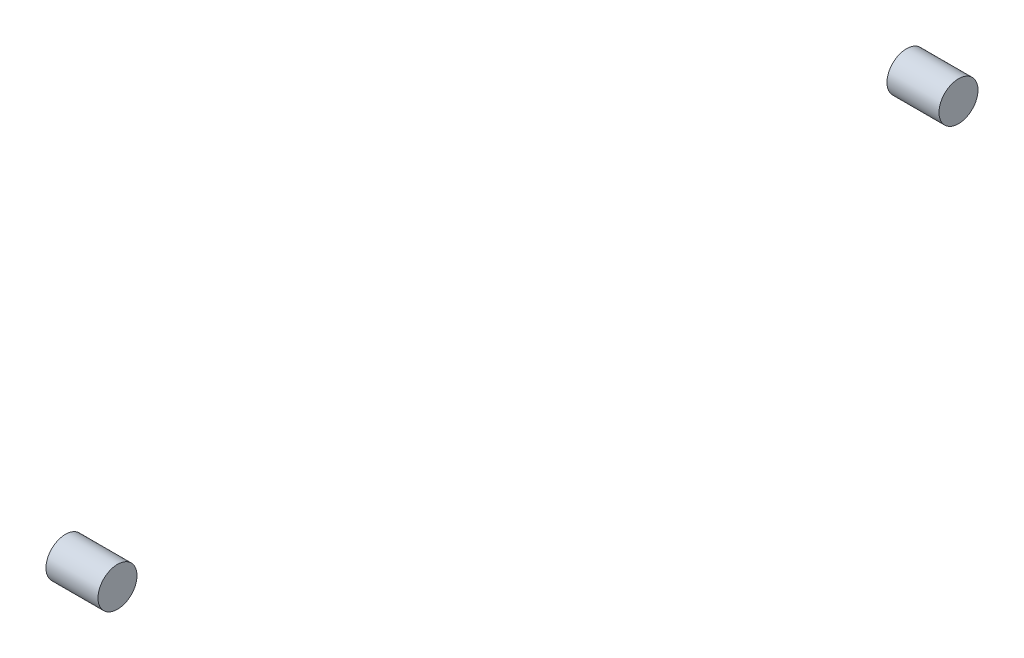
ISO-10303-21;
HEADER;
FILE_DESCRIPTION(('STEP AP214'),'2;1');
FILE_NAME('part.step','',(''),(''),'','','');
FILE_SCHEMA(('AUTOMOTIVE_DESIGN { 1 0 10303 214 1 1 1 1 }'));
ENDSEC;
DATA;
#1=APPLICATION_CONTEXT('core data for automotive mechanical design processes');
#2=APPLICATION_PROTOCOL_DEFINITION('international standard','automotive_design',2000,#1);
#3=PRODUCT_CONTEXT('',#1,'mechanical');
#4=PRODUCT('Part','Part','',(#3));
#5=PRODUCT_RELATED_PRODUCT_CATEGORY('part','',(#4));
#6=PRODUCT_DEFINITION_FORMATION('','',#4);
#7=PRODUCT_DEFINITION_CONTEXT('part definition',#1,'design');
#8=PRODUCT_DEFINITION('design','',#6,#7);
#9=PRODUCT_DEFINITION_SHAPE('','',#8);
#10=(LENGTH_UNIT() NAMED_UNIT(*) SI_UNIT(.MILLI.,.METRE.));
#11=(NAMED_UNIT(*) PLANE_ANGLE_UNIT() SI_UNIT($,.RADIAN.));
#12=(NAMED_UNIT(*) SI_UNIT($,.STERADIAN.) SOLID_ANGLE_UNIT());
#13=UNCERTAINTY_MEASURE_WITH_UNIT(LENGTH_MEASURE(1.E-05),#10,'distance_accuracy_value','');
#14=(GEOMETRIC_REPRESENTATION_CONTEXT(3) GLOBAL_UNCERTAINTY_ASSIGNED_CONTEXT((#13)) GLOBAL_UNIT_ASSIGNED_CONTEXT((#10,
#11,#12)) REPRESENTATION_CONTEXT('',''));
#15=CARTESIAN_POINT('',(0.,0.,0.));
#16=DIRECTION('',(0.,0.,1.));
#17=DIRECTION('',(1.,0.,0.));
#18=AXIS2_PLACEMENT_3D('',#15,#16,#17);
#19=CARTESIAN_POINT('',(-930.,-80.0000000000001,1940.));
#20=DIRECTION('',(-1.,0.,0.));
#21=DIRECTION('',(0.,0.,1.));
#22=AXIS2_PLACEMENT_3D('',#19,#20,#21);
#23=CYLINDRICAL_SURFACE('',#22,90.0000000000001);
#24=CARTESIAN_POINT('',(-930.,-80.0000000000001,1940.));
#25=DIRECTION('',(1.,0.,0.));
#26=DIRECTION('',(0.,0.,-1.));
#27=AXIS2_PLACEMENT_3D('',#24,#25,#26);
#28=CIRCLE('',#27,90.0000000000001);
#29=CARTESIAN_POINT('',(-930.,-80.0000000000001,1850.));
#30=VERTEX_POINT('',#29);
#31=EDGE_CURVE('E11',#30,#30,#28,.T.);
#32=ORIENTED_EDGE('',*,*,#31,.F.);
#33=EDGE_LOOP('',(#32));
#34=FACE_BOUND('',#33,.T.);
#35=CARTESIAN_POINT('',(-1170.,-80.0000000000001,1940.));
#36=DIRECTION('',(1.,0.,0.));
#37=DIRECTION('',(0.,0.,-1.));
#38=AXIS2_PLACEMENT_3D('',#35,#36,#37);
#39=CIRCLE('',#38,90.0000000000001);
#40=CARTESIAN_POINT('',(-1170.,-80.0000000000001,1850.));
#41=VERTEX_POINT('',#40);
#42=EDGE_CURVE('E48',#41,#41,#39,.T.);
#43=ORIENTED_EDGE('',*,*,#42,.T.);
#44=EDGE_LOOP('',(#43));
#45=FACE_BOUND('',#44,.T.);
#46=ADVANCED_FACE('F44',(#34,#45),#23,.T.);
#47=CARTESIAN_POINT('',(-930.,-80.0000000000001,1940.));
#48=DIRECTION('',(1.,0.,0.));
#49=DIRECTION('',(0.,0.,-1.));
#50=AXIS2_PLACEMENT_3D('',#47,#48,#49);
#51=PLANE('',#50);
#52=ORIENTED_EDGE('',*,*,#31,.T.);
#53=EDGE_LOOP('',(#52));
#54=FACE_BOUND('',#53,.T.);
#55=ADVANCED_FACE('F58',(#54),#51,.T.);
#56=CARTESIAN_POINT('',(-1170.,-80.0000000000001,1940.));
#57=DIRECTION('',(1.,0.,0.));
#58=DIRECTION('',(0.,0.,-1.));
#59=AXIS2_PLACEMENT_3D('',#56,#57,#58);
#60=PLANE('',#59);
#61=ORIENTED_EDGE('',*,*,#42,.F.);
#62=EDGE_LOOP('',(#61));
#63=FACE_BOUND('',#62,.T.);
#64=ADVANCED_FACE('F59',(#63),#60,.F.);
#65=CLOSED_SHELL('',(#46,#55,#64));
#66=MANIFOLD_SOLID_BREP('B2',#65);
#67=CARTESIAN_POINT('',(-930.,-80.0000000000001,-1940.));
#68=DIRECTION('',(-1.,0.,0.));
#69=DIRECTION('',(0.,0.,1.));
#70=AXIS2_PLACEMENT_3D('',#67,#68,#69);
#71=CYLINDRICAL_SURFACE('',#70,89.9999999999999);
#72=CARTESIAN_POINT('',(-930.,-80.0000000000001,-1940.));
#73=DIRECTION('',(1.,0.,0.));
#74=DIRECTION('',(0.,0.,-1.));
#75=AXIS2_PLACEMENT_3D('',#72,#73,#74);
#76=CIRCLE('',#75,89.9999999999999);
#77=CARTESIAN_POINT('',(-930.,-80.0000000000001,-2030.));
#78=VERTEX_POINT('',#77);
#79=EDGE_CURVE('E42',#78,#78,#76,.T.);
#80=ORIENTED_EDGE('',*,*,#79,.F.);
#81=EDGE_LOOP('',(#80));
#82=FACE_BOUND('',#81,.T.);
#83=CARTESIAN_POINT('',(-1170.,-80.0000000000001,-1940.));
#84=DIRECTION('',(1.,0.,0.));
#85=DIRECTION('',(0.,0.,-1.));
#86=AXIS2_PLACEMENT_3D('',#83,#84,#85);
#87=CIRCLE('',#86,89.9999999999999);
#88=CARTESIAN_POINT('',(-1170.,-80.0000000000001,-2030.));
#89=VERTEX_POINT('',#88);
#90=EDGE_CURVE('E90',#89,#89,#87,.T.);
#91=ORIENTED_EDGE('',*,*,#90,.T.);
#92=EDGE_LOOP('',(#91));
#93=FACE_BOUND('',#92,.T.);
#94=ADVANCED_FACE('F88',(#82,#93),#71,.T.);
#95=CARTESIAN_POINT('',(-930.,-80.0000000000001,-1940.));
#96=DIRECTION('',(1.,0.,0.));
#97=DIRECTION('',(0.,0.,-1.));
#98=AXIS2_PLACEMENT_3D('',#95,#96,#97);
#99=PLANE('',#98);
#100=ORIENTED_EDGE('',*,*,#79,.T.);
#101=EDGE_LOOP('',(#100));
#102=FACE_BOUND('',#101,.T.);
#103=ADVANCED_FACE('F101',(#102),#99,.T.);
#104=CARTESIAN_POINT('',(-1170.,-80.0000000000001,-1940.));
#105=DIRECTION('',(1.,0.,0.));
#106=DIRECTION('',(0.,0.,-1.));
#107=AXIS2_PLACEMENT_3D('',#104,#105,#106);
#108=PLANE('',#107);
#109=ORIENTED_EDGE('',*,*,#90,.F.);
#110=EDGE_LOOP('',(#109));
#111=FACE_BOUND('',#110,.T.);
#112=ADVANCED_FACE('F97',(#111),#108,.F.);
#113=CLOSED_SHELL('',(#94,#103,#112));
#114=MANIFOLD_SOLID_BREP('B6',#113);
#115=ADVANCED_BREP_SHAPE_REPRESENTATION('',(#18,#66,#114),#14);
#116=SHAPE_DEFINITION_REPRESENTATION(#9,#115);
ENDSEC;
END-ISO-10303-21;
